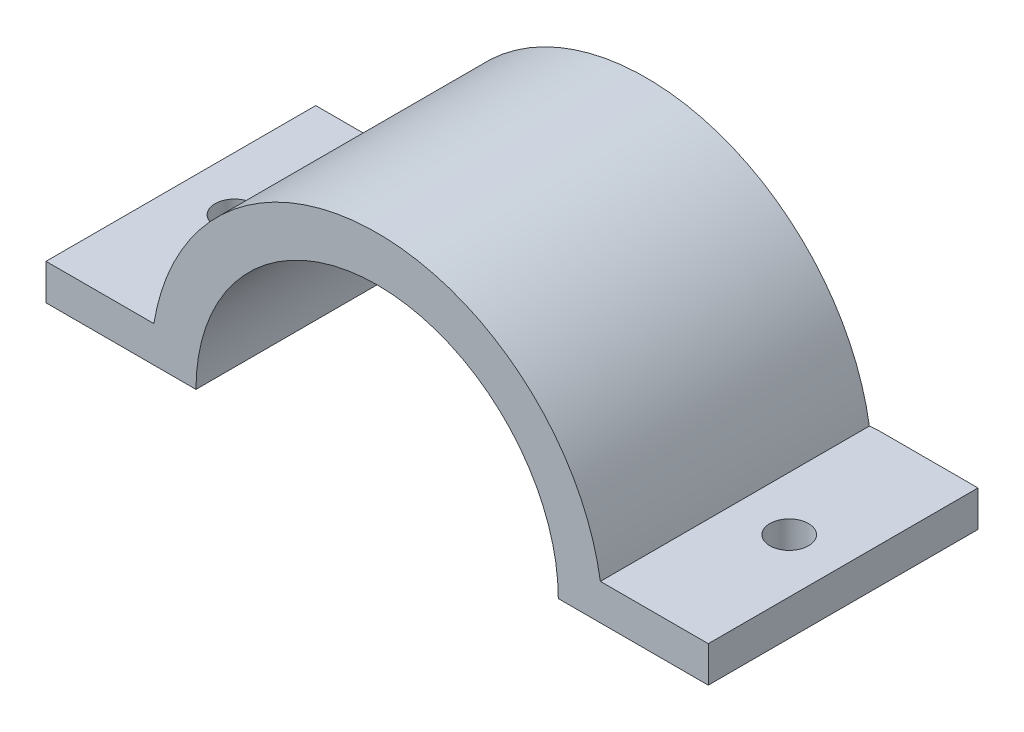
ISO-10303-21;
HEADER;
FILE_DESCRIPTION(('STEP AP214'),'2;1');
FILE_NAME('part.step','',(''),(''),'','','');
FILE_SCHEMA(('AUTOMOTIVE_DESIGN { 1 0 10303 214 1 1 1 1 }'));
ENDSEC;
DATA;
#1=APPLICATION_CONTEXT('core data for automotive mechanical design processes');
#2=APPLICATION_PROTOCOL_DEFINITION('international standard','automotive_design',2000,#1);
#3=PRODUCT_CONTEXT('',#1,'mechanical');
#4=PRODUCT('Part','Part','',(#3));
#5=PRODUCT_RELATED_PRODUCT_CATEGORY('part','',(#4));
#6=PRODUCT_DEFINITION_FORMATION('','',#4);
#7=PRODUCT_DEFINITION_CONTEXT('part definition',#1,'design');
#8=PRODUCT_DEFINITION('design','',#6,#7);
#9=PRODUCT_DEFINITION_SHAPE('','',#8);
#10=(LENGTH_UNIT() NAMED_UNIT(*) SI_UNIT(.MILLI.,.METRE.));
#11=(NAMED_UNIT(*) PLANE_ANGLE_UNIT() SI_UNIT($,.RADIAN.));
#12=(NAMED_UNIT(*) SI_UNIT($,.STERADIAN.) SOLID_ANGLE_UNIT());
#13=UNCERTAINTY_MEASURE_WITH_UNIT(LENGTH_MEASURE(1.E-05),#10,'distance_accuracy_value','');
#14=(GEOMETRIC_REPRESENTATION_CONTEXT(3) GLOBAL_UNCERTAINTY_ASSIGNED_CONTEXT((#13)) GLOBAL_UNIT_ASSIGNED_CONTEXT((#10,
#11,#12)) REPRESENTATION_CONTEXT('',''));
#15=CARTESIAN_POINT('',(0.,0.,0.));
#16=DIRECTION('',(0.,0.,1.));
#17=DIRECTION('',(1.,0.,0.));
#18=AXIS2_PLACEMENT_3D('',#15,#16,#17);
#19=CARTESIAN_POINT('',(-30.8298711233063,0.,15.0419601084502));
#20=DIRECTION('',(0.,1.,0.));
#21=DIRECTION('',(-1.,0.,0.));
#22=AXIS2_PLACEMENT_3D('',#19,#20,#21);
#23=PLANE('',#22);
#24=CARTESIAN_POINT('',(-30.8298711233063,0.,15.0419601084502));
#25=DIRECTION('',(0.,1.,0.));
#26=DIRECTION('',(-1.,0.,0.));
#27=AXIS2_PLACEMENT_3D('',#24,#25,#26);
#28=CIRCLE('',#27,2.15);
#29=CARTESIAN_POINT('',(-32.9798711233063,0.,15.0419601084502));
#30=VERTEX_POINT('',#29);
#31=EDGE_CURVE('E503',#30,#30,#28,.T.);
#32=ORIENTED_EDGE('',*,*,#31,.T.);
#33=EDGE_LOOP('',(#32));
#34=FACE_BOUND('',#33,.T.);
#35=DIRECTION('',(0.,0.,-1.));
#36=VECTOR('',#35,1.);
#37=CARTESIAN_POINT('',(-36.8298711233063,0.,30.));
#38=LINE('',#37,#36);
#39=CARTESIAN_POINT('',(-36.8298711233063,0.,30.));
#40=VERTEX_POINT('',#39);
#41=CARTESIAN_POINT('',(-36.8298711233063,0.,0.));
#42=VERTEX_POINT('',#41);
#43=EDGE_CURVE('E50',#40,#42,#38,.T.);
#44=ORIENTED_EDGE('',*,*,#43,.T.);
#45=DIRECTION('',(-1.,0.,0.));
#46=VECTOR('',#45,1.);
#47=CARTESIAN_POINT('',(0.,0.,0.));
#48=LINE('',#47,#46);
#49=CARTESIAN_POINT('',(-26.15,0.,0.));
#50=VERTEX_POINT('',#49);
#51=EDGE_CURVE('E247',#50,#42,#48,.T.);
#52=ORIENTED_EDGE('',*,*,#51,.F.);
#53=CARTESIAN_POINT('',(-26.15,0.,6.));
#54=DIRECTION('',(0.,1.,0.));
#55=DIRECTION('',(0.,0.,1.));
#56=AXIS2_PLACEMENT_3D('',#53,#54,#55);
#57=CIRCLE('',#56,6.);
#58=CARTESIAN_POINT('',(-20.15,0.,6.));
#59=VERTEX_POINT('',#58);
#60=EDGE_CURVE('E56',#50,#59,#57,.F.);
#61=ORIENTED_EDGE('',*,*,#60,.T.);
#62=DIRECTION('',(0.,0.,-1.));
#63=VECTOR('',#62,1.);
#64=CARTESIAN_POINT('',(-20.15,0.,30.));
#65=LINE('',#64,#63);
#66=CARTESIAN_POINT('',(-20.15,0.,30.));
#67=VERTEX_POINT('',#66);
#68=EDGE_CURVE('E70',#59,#67,#65,.F.);
#69=ORIENTED_EDGE('',*,*,#68,.T.);
#70=DIRECTION('',(-1.,0.,0.));
#71=VECTOR('',#70,1.);
#72=CARTESIAN_POINT('',(0.,0.,30.));
#73=LINE('',#72,#71);
#74=EDGE_CURVE('E248',#67,#40,#73,.T.);
#75=ORIENTED_EDGE('',*,*,#74,.T.);
#76=EDGE_LOOP('',(#44,#52,#61,#69,#75));
#77=FACE_BOUND('',#76,.T.);
#78=ADVANCED_FACE('F45',(#34,#77),#23,.F.);
#79=CARTESIAN_POINT('',(-36.8298711233063,0.,30.));
#80=DIRECTION('',(-1.,0.,0.));
#81=DIRECTION('',(0.,0.,1.));
#82=AXIS2_PLACEMENT_3D('',#79,#80,#81);
#83=PLANE('',#82);
#84=ORIENTED_EDGE('',*,*,#43,.F.);
#85=DIRECTION('',(0.,1.,0.));
#86=VECTOR('',#85,1.);
#87=CARTESIAN_POINT('',(-36.8298711233063,0.,30.));
#88=LINE('',#87,#86);
#89=CARTESIAN_POINT('',(-36.8298711233063,4.,30.));
#90=VERTEX_POINT('',#89);
#91=EDGE_CURVE('E172',#40,#90,#88,.T.);
#92=ORIENTED_EDGE('',*,*,#91,.T.);
#93=DIRECTION('',(0.,0.,-1.));
#94=VECTOR('',#93,1.);
#95=CARTESIAN_POINT('',(-36.8298711233063,4.,30.));
#96=LINE('',#95,#94);
#97=CARTESIAN_POINT('',(-36.8298711233063,4.,0.));
#98=VERTEX_POINT('',#97);
#99=EDGE_CURVE('E175',#90,#98,#96,.T.);
#100=ORIENTED_EDGE('',*,*,#99,.T.);
#101=DIRECTION('',(0.,1.,0.));
#102=VECTOR('',#101,1.);
#103=CARTESIAN_POINT('',(-36.8298711233063,0.,0.));
#104=LINE('',#103,#102);
#105=EDGE_CURVE('E185',#42,#98,#104,.T.);
#106=ORIENTED_EDGE('',*,*,#105,.F.);
#107=EDGE_LOOP('',(#84,#92,#100,#106));
#108=FACE_BOUND('',#107,.T.);
#109=ADVANCED_FACE('F226',(#108),#83,.T.);
#110=CARTESIAN_POINT('',(0.,0.,30.));
#111=DIRECTION('',(0.,0.,-1.));
#112=DIRECTION('',(-1.,0.,0.));
#113=AXIS2_PLACEMENT_3D('',#110,#111,#112);
#114=CYLINDRICAL_SURFACE('',#113,20.15);
#115=DIRECTION('',(0.,0.,-1.));
#116=VECTOR('',#115,1.);
#117=CARTESIAN_POINT('',(20.15,0.,30.));
#118=LINE('',#117,#116);
#119=CARTESIAN_POINT('',(20.15,0.,30.));
#120=VERTEX_POINT('',#119);
#121=CARTESIAN_POINT('',(20.15,0.,6.));
#122=VERTEX_POINT('',#121);
#123=EDGE_CURVE('E242',#120,#122,#118,.T.);
#124=ORIENTED_EDGE('',*,*,#123,.F.);
#125=CARTESIAN_POINT('',(0.,0.,30.));
#126=DIRECTION('',(0.,0.,1.));
#127=DIRECTION('',(1.,0.,0.));
#128=AXIS2_PLACEMENT_3D('',#125,#126,#127);
#129=CIRCLE('',#128,20.15);
#130=EDGE_CURVE('E141',#120,#67,#129,.T.);
#131=ORIENTED_EDGE('',*,*,#130,.T.);
#132=ORIENTED_EDGE('',*,*,#68,.F.);
#133=CARTESIAN_POINT('',(0.,0.,6.));
#134=DIRECTION('',(0.,0.,1.));
#135=DIRECTION('',(1.,0.,0.));
#136=AXIS2_PLACEMENT_3D('',#133,#134,#135);
#137=CIRCLE('',#136,20.15);
#138=EDGE_CURVE('E235',#59,#122,#137,.F.);
#139=ORIENTED_EDGE('',*,*,#138,.T.);
#140=EDGE_LOOP('',(#124,#131,#132,#139));
#141=FACE_BOUND('',#140,.T.);
#142=ADVANCED_FACE('F272',(#141),#114,.F.);
#143=CARTESIAN_POINT('',(0.,0.,0.));
#144=DIRECTION('',(0.,0.,1.));
#145=DIRECTION('',(1.,0.,0.));
#146=AXIS2_PLACEMENT_3D('',#143,#144,#145);
#147=PLANE('',#146);
#148=DIRECTION('',(0.,1.,0.));
#149=VECTOR('',#148,1.);
#150=CARTESIAN_POINT('',(36.8298711233063,0.,0.));
#151=LINE('',#150,#149);
#152=CARTESIAN_POINT('',(36.8298711233063,0.,0.));
#153=VERTEX_POINT('',#152);
#154=CARTESIAN_POINT('',(36.8298711233063,4.00000000000001,0.));
#155=VERTEX_POINT('',#154);
#156=EDGE_CURVE('E160',#153,#155,#151,.T.);
#157=ORIENTED_EDGE('',*,*,#156,.F.);
#158=DIRECTION('',(-1.,0.,0.));
#159=VECTOR('',#158,1.);
#160=CARTESIAN_POINT('',(0.,0.,0.));
#161=LINE('',#160,#159);
#162=CARTESIAN_POINT('',(26.15,0.,0.));
#163=VERTEX_POINT('',#162);
#164=EDGE_CURVE('E237',#153,#163,#161,.T.);
#165=ORIENTED_EDGE('',*,*,#164,.T.);
#166=CARTESIAN_POINT('',(0.,0.,0.));
#167=DIRECTION('',(0.,0.,1.));
#168=DIRECTION('',(1.,0.,0.));
#169=AXIS2_PLACEMENT_3D('',#166,#167,#168);
#170=CIRCLE('',#169,26.15);
#171=CARTESIAN_POINT('',(25.8422618979067,4.,0.));
#172=VERTEX_POINT('',#171);
#173=EDGE_CURVE('E191',#163,#172,#170,.T.);
#174=ORIENTED_EDGE('',*,*,#173,.T.);
#175=DIRECTION('',(1.,0.,0.));
#176=VECTOR('',#175,1.);
#177=CARTESIAN_POINT('',(0.,3.99999999999997,0.));
#178=LINE('',#177,#176);
#179=EDGE_CURVE('E178',#172,#155,#178,.T.);
#180=ORIENTED_EDGE('',*,*,#179,.T.);
#181=EDGE_LOOP('',(#157,#165,#174,#180));
#182=FACE_BOUND('',#181,.T.);
#183=ADVANCED_FACE('F216',(#182),#147,.F.);
#184=CARTESIAN_POINT('',(0.,3.99999999999997,30.));
#185=DIRECTION('',(0.,1.,0.));
#186=DIRECTION('',(-1.,0.,0.));
#187=AXIS2_PLACEMENT_3D('',#184,#185,#186);
#188=PLANE('',#187);
#189=CARTESIAN_POINT('',(30.8298711233063,4.00000000000001,15.));
#190=DIRECTION('',(0.,1.,0.));
#191=DIRECTION('',(-1.,0.,0.));
#192=AXIS2_PLACEMENT_3D('',#189,#190,#191);
#193=CIRCLE('',#192,2.15);
#194=CARTESIAN_POINT('',(28.6798711233063,4.,15.));
#195=VERTEX_POINT('',#194);
#196=EDGE_CURVE('E167',#195,#195,#193,.T.);
#197=ORIENTED_EDGE('',*,*,#196,.F.);
#198=EDGE_LOOP('',(#197));
#199=FACE_BOUND('',#198,.T.);
#200=ORIENTED_EDGE('',*,*,#179,.F.);
#201=CARTESIAN_POINT('',(25.8422618979067,4.,0.));
#202=CARTESIAN_POINT('',(25.6723729542656,4.,2.89162865767323E-05));
#203=CARTESIAN_POINT('',(25.5030625139916,4.,0.00703673760638123));
#204=CARTESIAN_POINT('',(25.1655989244071,4.,0.0350101667517792));
#205=CARTESIAN_POINT('',(24.9974457731476,4.,0.0559757510654354));
#206=CARTESIAN_POINT('',(24.8298711233063,4.,0.0839202169003822));
#207=B_SPLINE_CURVE_WITH_KNOTS('',3,(#201,#202,#203,#204,#205,#206),.UNSPECIFIED.,.F.,.F.,(4,2,
4),(0.,0.508366219086978,1.01673158183011),.UNSPECIFIED.);
#208=CARTESIAN_POINT('',(24.8298711233063,4.,0.0839202169003808));
#209=VERTEX_POINT('',#208);
#210=EDGE_CURVE('E136',#172,#209,#207,.T.);
#211=ORIENTED_EDGE('',*,*,#210,.T.);
#212=DIRECTION('',(0.,0.,-1.));
#213=VECTOR('',#212,1.);
#214=CARTESIAN_POINT('',(24.8298711233063,4.,30.));
#215=LINE('',#214,#213);
#216=CARTESIAN_POINT('',(24.8298711233063,4.,30.));
#217=VERTEX_POINT('',#216);
#218=EDGE_CURVE('E128',#217,#209,#215,.T.);
#219=ORIENTED_EDGE('',*,*,#218,.F.);
#220=DIRECTION('',(1.,0.,0.));
#221=VECTOR('',#220,1.);
#222=CARTESIAN_POINT('',(0.,3.99999999999997,30.));
#223=LINE('',#222,#221);
#224=CARTESIAN_POINT('',(36.8298711233063,4.00000000000001,30.));
#225=VERTEX_POINT('',#224);
#226=EDGE_CURVE('E134',#217,#225,#223,.T.);
#227=ORIENTED_EDGE('',*,*,#226,.T.);
#228=DIRECTION('',(0.,0.,-1.));
#229=VECTOR('',#228,1.);
#230=CARTESIAN_POINT('',(36.8298711233063,4.00000000000001,30.));
#231=LINE('',#230,#229);
#232=EDGE_CURVE('E140',#225,#155,#231,.T.);
#233=ORIENTED_EDGE('',*,*,#232,.T.);
#234=EDGE_LOOP('',(#200,#211,#219,#227,#233));
#235=FACE_BOUND('',#234,.T.);
#236=ADVANCED_FACE('F131',(#199,#235),#188,.T.);
#237=CARTESIAN_POINT('',(30.8298711233063,0.,15.));
#238=DIRECTION('',(0.,1.,0.));
#239=DIRECTION('',(-1.,0.,0.));
#240=AXIS2_PLACEMENT_3D('',#237,#238,#239);
#241=CYLINDRICAL_SURFACE('',#240,2.15);
#242=CARTESIAN_POINT('',(30.8298711233063,0.,15.));
#243=DIRECTION('',(0.,1.,0.));
#244=DIRECTION('',(-1.,0.,0.));
#245=AXIS2_PLACEMENT_3D('',#242,#243,#244);
#246=CIRCLE('',#245,2.15);
#247=CARTESIAN_POINT('',(28.6798711233063,0.,15.));
#248=VERTEX_POINT('',#247);
#249=EDGE_CURVE('E505',#248,#248,#246,.T.);
#250=ORIENTED_EDGE('',*,*,#249,.F.);
#251=EDGE_LOOP('',(#250));
#252=FACE_BOUND('',#251,.T.);
#253=ORIENTED_EDGE('',*,*,#196,.T.);
#254=EDGE_LOOP('',(#253));
#255=FACE_BOUND('',#254,.T.);
#256=ADVANCED_FACE('F215',(#252,#255),#241,.F.);
#257=CARTESIAN_POINT('',(0.,0.,30.));
#258=DIRECTION('',(0.,0.,-1.));
#259=DIRECTION('',(-1.,0.,0.));
#260=AXIS2_PLACEMENT_3D('',#257,#258,#259);
#261=CYLINDRICAL_SURFACE('',#260,25.15);
#262=ORIENTED_EDGE('',*,*,#218,.T.);
#263=CARTESIAN_POINT('',(0.,0.,0.0839202169003808));
#264=DIRECTION('',(0.,0.,-1.));
#265=DIRECTION('',(-1.,0.,0.));
#266=AXIS2_PLACEMENT_3D('',#263,#264,#265);
#267=CIRCLE('',#266,25.15);
#268=CARTESIAN_POINT('',(-24.8298711233063,4.,0.0839202169003808));
#269=VERTEX_POINT('',#268);
#270=EDGE_CURVE('E210',#209,#269,#267,.F.);
#271=ORIENTED_EDGE('',*,*,#270,.T.);
#272=DIRECTION('',(0.,0.,-1.));
#273=VECTOR('',#272,1.);
#274=CARTESIAN_POINT('',(-24.8298711233063,4.,30.));
#275=LINE('',#274,#273);
#276=CARTESIAN_POINT('',(-24.8298711233063,4.,30.));
#277=VERTEX_POINT('',#276);
#278=EDGE_CURVE('E147',#277,#269,#275,.T.);
#279=ORIENTED_EDGE('',*,*,#278,.F.);
#280=CARTESIAN_POINT('',(0.,0.,30.));
#281=DIRECTION('',(0.,0.,1.));
#282=DIRECTION('',(1.,0.,0.));
#283=AXIS2_PLACEMENT_3D('',#280,#281,#282);
#284=CIRCLE('',#283,25.15);
#285=EDGE_CURVE('E144',#217,#277,#284,.T.);
#286=ORIENTED_EDGE('',*,*,#285,.F.);
#287=EDGE_LOOP('',(#262,#271,#279,#286));
#288=FACE_BOUND('',#287,.T.);
#289=ADVANCED_FACE('F145',(#288),#261,.T.);
#290=CARTESIAN_POINT('',(0.,4.,30.));
#291=DIRECTION('',(0.,-1.,0.));
#292=DIRECTION('',(1.,0.,0.));
#293=AXIS2_PLACEMENT_3D('',#290,#291,#292);
#294=PLANE('',#293);
#295=CARTESIAN_POINT('',(-30.8298711233063,3.99999999999994,15.0419601084502));
#296=DIRECTION('',(0.,1.,0.));
#297=DIRECTION('',(-1.,0.,0.));
#298=AXIS2_PLACEMENT_3D('',#295,#296,#297);
#299=CIRCLE('',#298,2.15);
#300=CARTESIAN_POINT('',(-32.9798711233063,3.99999999999994,15.0419601084502));
#301=VERTEX_POINT('',#300);
#302=EDGE_CURVE('E181',#301,#301,#299,.T.);
#303=ORIENTED_EDGE('',*,*,#302,.F.);
#304=EDGE_LOOP('',(#303));
#305=FACE_BOUND('',#304,.T.);
#306=ORIENTED_EDGE('',*,*,#278,.T.);
#307=CARTESIAN_POINT('',(-24.8298711233063,4.,0.0839202169003826));
#308=CARTESIAN_POINT('',(-24.9974457731476,4.,0.055975751065436));
#309=CARTESIAN_POINT('',(-25.1655989244071,4.,0.0350101667517798));
#310=CARTESIAN_POINT('',(-25.5030625139916,4.,0.00703673760638121));
#311=CARTESIAN_POINT('',(-25.6723729542656,4.,2.89162865761221E-05));
#312=CARTESIAN_POINT('',(-25.8422618979067,4.,0.));
#313=B_SPLINE_CURVE_WITH_KNOTS('',3,(#307,#308,#309,#310,#311,#312),.UNSPECIFIED.,.F.,.F.,(4,2,
4),(0.,0.508365362743136,1.01673158183011),.UNSPECIFIED.);
#314=CARTESIAN_POINT('',(-25.8422618979067,4.,0.));
#315=VERTEX_POINT('',#314);
#316=EDGE_CURVE('E228',#269,#315,#313,.T.);
#317=ORIENTED_EDGE('',*,*,#316,.T.);
#318=DIRECTION('',(-1.,0.,0.));
#319=VECTOR('',#318,1.);
#320=CARTESIAN_POINT('',(0.,4.,0.));
#321=LINE('',#320,#319);
#322=EDGE_CURVE('E186',#315,#98,#321,.T.);
#323=ORIENTED_EDGE('',*,*,#322,.T.);
#324=ORIENTED_EDGE('',*,*,#99,.F.);
#325=DIRECTION('',(-1.,0.,0.));
#326=VECTOR('',#325,1.);
#327=CARTESIAN_POINT('',(0.,4.,30.));
#328=LINE('',#327,#326);
#329=EDGE_CURVE('E153',#277,#90,#328,.T.);
#330=ORIENTED_EDGE('',*,*,#329,.F.);
#331=EDGE_LOOP('',(#306,#317,#323,#324,#330));
#332=FACE_BOUND('',#331,.T.);
#333=ADVANCED_FACE('F220',(#305,#332),#294,.F.);
#334=CARTESIAN_POINT('',(-30.8298711233063,0.,15.0419601084502));
#335=DIRECTION('',(0.,1.,0.));
#336=DIRECTION('',(-1.,0.,0.));
#337=AXIS2_PLACEMENT_3D('',#334,#335,#336);
#338=CYLINDRICAL_SURFACE('',#337,2.15);
#339=ORIENTED_EDGE('',*,*,#31,.F.);
#340=EDGE_LOOP('',(#339));
#341=FACE_BOUND('',#340,.T.);
#342=ORIENTED_EDGE('',*,*,#302,.T.);
#343=EDGE_LOOP('',(#342));
#344=FACE_BOUND('',#343,.T.);
#345=ADVANCED_FACE('F224',(#341,#344),#338,.F.);
#346=CARTESIAN_POINT('',(0.,0.,0.));
#347=DIRECTION('',(0.,0.,1.));
#348=DIRECTION('',(1.,0.,0.));
#349=AXIS2_PLACEMENT_3D('',#346,#347,#348);
#350=CIRCLE('',#349,26.15);
#351=EDGE_CURVE('E200',#315,#50,#350,.T.);
#352=ORIENTED_EDGE('',*,*,#351,.T.);
#353=ORIENTED_EDGE('',*,*,#51,.T.);
#354=ORIENTED_EDGE('',*,*,#105,.T.);
#355=ORIENTED_EDGE('',*,*,#322,.F.);
#356=EDGE_LOOP('',(#352,#353,#354,#355));
#357=FACE_BOUND('',#356,.T.);
#358=ADVANCED_FACE('F267',(#357),#147,.F.);
#359=CARTESIAN_POINT('',(0.,0.,6.));
#360=DIRECTION('',(0.,0.,1.));
#361=DIRECTION('',(1.,0.,0.));
#362=AXIS2_PLACEMENT_3D('',#359,#360,#361);
#363=TOROIDAL_SURFACE('',#362,26.15,6.);
#364=ORIENTED_EDGE('',*,*,#60,.F.);
#365=ORIENTED_EDGE('',*,*,#351,.F.);
#366=ORIENTED_EDGE('',*,*,#316,.F.);
#367=ORIENTED_EDGE('',*,*,#270,.F.);
#368=ORIENTED_EDGE('',*,*,#210,.F.);
#369=ORIENTED_EDGE('',*,*,#173,.F.);
#370=CARTESIAN_POINT('',(26.15,0.,6.));
#371=DIRECTION('',(0.,1.,0.));
#372=DIRECTION('',(0.,0.,1.));
#373=AXIS2_PLACEMENT_3D('',#370,#371,#372);
#374=CIRCLE('',#373,6.);
#375=EDGE_CURVE('E11',#122,#163,#374,.F.);
#376=ORIENTED_EDGE('',*,*,#375,.F.);
#377=ORIENTED_EDGE('',*,*,#138,.F.);
#378=EDGE_LOOP('',(#364,#365,#366,#367,#368,#369,#376,#377));
#379=FACE_BOUND('',#378,.T.);
#380=ADVANCED_FACE('F47',(#379),#363,.T.);
#381=CARTESIAN_POINT('',(36.8298711233063,0.,30.));
#382=DIRECTION('',(-1.,0.,0.));
#383=DIRECTION('',(0.,0.,1.));
#384=AXIS2_PLACEMENT_3D('',#381,#382,#383);
#385=PLANE('',#384);
#386=DIRECTION('',(0.,1.,0.));
#387=VECTOR('',#386,1.);
#388=CARTESIAN_POINT('',(36.8298711233063,0.,30.));
#389=LINE('',#388,#387);
#390=CARTESIAN_POINT('',(36.8298711233063,0.,30.));
#391=VERTEX_POINT('',#390);
#392=EDGE_CURVE('E152',#391,#225,#389,.T.);
#393=ORIENTED_EDGE('',*,*,#392,.F.);
#394=DIRECTION('',(0.,0.,-1.));
#395=VECTOR('',#394,1.);
#396=CARTESIAN_POINT('',(36.8298711233063,0.,30.));
#397=LINE('',#396,#395);
#398=EDGE_CURVE('E241',#391,#153,#397,.T.);
#399=ORIENTED_EDGE('',*,*,#398,.T.);
#400=ORIENTED_EDGE('',*,*,#156,.T.);
#401=ORIENTED_EDGE('',*,*,#232,.F.);
#402=EDGE_LOOP('',(#393,#399,#400,#401));
#403=FACE_BOUND('',#402,.T.);
#404=ADVANCED_FACE('F277',(#403),#385,.F.);
#405=CARTESIAN_POINT('',(0.,0.,30.));
#406=DIRECTION('',(0.,0.,1.));
#407=DIRECTION('',(1.,0.,0.));
#408=AXIS2_PLACEMENT_3D('',#405,#406,#407);
#409=PLANE('',#408);
#410=EDGE_CURVE('E251',#391,#120,#73,.T.);
#411=ORIENTED_EDGE('',*,*,#410,.F.);
#412=ORIENTED_EDGE('',*,*,#392,.T.);
#413=ORIENTED_EDGE('',*,*,#226,.F.);
#414=ORIENTED_EDGE('',*,*,#285,.T.);
#415=ORIENTED_EDGE('',*,*,#329,.T.);
#416=ORIENTED_EDGE('',*,*,#91,.F.);
#417=ORIENTED_EDGE('',*,*,#74,.F.);
#418=ORIENTED_EDGE('',*,*,#130,.F.);
#419=EDGE_LOOP('',(#411,#412,#413,#414,#415,#416,#417,#418));
#420=FACE_BOUND('',#419,.T.);
#421=ADVANCED_FACE('F156',(#420),#409,.T.);
#422=CARTESIAN_POINT('',(30.8298711233063,0.,15.));
#423=DIRECTION('',(0.,1.,0.));
#424=DIRECTION('',(-1.,0.,0.));
#425=AXIS2_PLACEMENT_3D('',#422,#423,#424);
#426=PLANE('',#425);
#427=ORIENTED_EDGE('',*,*,#249,.T.);
#428=EDGE_LOOP('',(#427));
#429=FACE_BOUND('',#428,.T.);
#430=ORIENTED_EDGE('',*,*,#410,.T.);
#431=ORIENTED_EDGE('',*,*,#123,.T.);
#432=ORIENTED_EDGE('',*,*,#375,.T.);
#433=ORIENTED_EDGE('',*,*,#164,.F.);
#434=ORIENTED_EDGE('',*,*,#398,.F.);
#435=EDGE_LOOP('',(#430,#431,#432,#433,#434));
#436=FACE_BOUND('',#435,.T.);
#437=ADVANCED_FACE('F281',(#429,#436),#426,.F.);
#438=CLOSED_SHELL('',(#78,#109,#142,#183,#236,#256,#289,#333,#345,#358,#380,#404,#421,#437));
#439=MANIFOLD_SOLID_BREP('B2',#438);
#440=ADVANCED_BREP_SHAPE_REPRESENTATION('',(#18,#439),#14);
#441=SHAPE_DEFINITION_REPRESENTATION(#9,#440);
ENDSEC;
END-ISO-10303-21;
